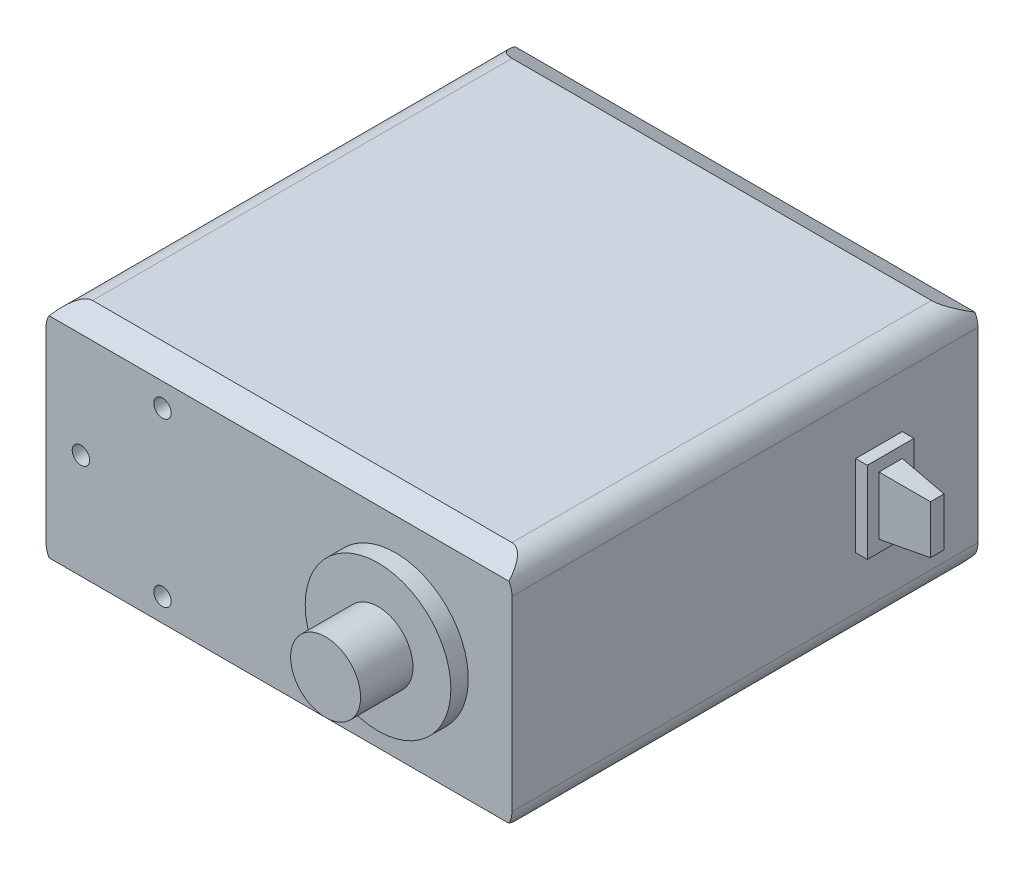
ISO-10303-21;
HEADER;
FILE_DESCRIPTION(('STEP AP214'),'2;1');
FILE_NAME('part.step','',(''),(''),'','','');
FILE_SCHEMA(('AUTOMOTIVE_DESIGN { 1 0 10303 214 1 1 1 1 }'));
ENDSEC;
DATA;
#1=APPLICATION_CONTEXT('core data for automotive mechanical design processes');
#2=APPLICATION_PROTOCOL_DEFINITION('international standard','automotive_design',2000,#1);
#3=PRODUCT_CONTEXT('',#1,'mechanical');
#4=PRODUCT('Part','Part','',(#3));
#5=PRODUCT_RELATED_PRODUCT_CATEGORY('part','',(#4));
#6=PRODUCT_DEFINITION_FORMATION('','',#4);
#7=PRODUCT_DEFINITION_CONTEXT('part definition',#1,'design');
#8=PRODUCT_DEFINITION('design','',#6,#7);
#9=PRODUCT_DEFINITION_SHAPE('','',#8);
#10=(LENGTH_UNIT() NAMED_UNIT(*) SI_UNIT(.MILLI.,.METRE.));
#11=(NAMED_UNIT(*) PLANE_ANGLE_UNIT() SI_UNIT($,.RADIAN.));
#12=(NAMED_UNIT(*) SI_UNIT($,.STERADIAN.) SOLID_ANGLE_UNIT());
#13=UNCERTAINTY_MEASURE_WITH_UNIT(LENGTH_MEASURE(1.E-05),#10,'distance_accuracy_value','');
#14=(GEOMETRIC_REPRESENTATION_CONTEXT(3) GLOBAL_UNCERTAINTY_ASSIGNED_CONTEXT((#13)) GLOBAL_UNIT_ASSIGNED_CONTEXT((#10,
#11,#12)) REPRESENTATION_CONTEXT('',''));
#15=CARTESIAN_POINT('',(0.,0.,0.));
#16=DIRECTION('',(0.,0.,1.));
#17=DIRECTION('',(1.,0.,0.));
#18=AXIS2_PLACEMENT_3D('',#15,#16,#17);
#19=CARTESIAN_POINT('',(40.,20.,0.));
#20=DIRECTION('',(-1.,0.,0.));
#21=DIRECTION('',(0.,0.,1.));
#22=AXIS2_PLACEMENT_3D('',#19,#20,#21);
#23=PLANE('',#22);
#24=DIRECTION('',(0.,-1.,0.));
#25=VECTOR('',#24,1.);
#26=CARTESIAN_POINT('',(40.,20.,40.));
#27=LINE('',#26,#25);
#28=CARTESIAN_POINT('',(40.,18.,40.));
#29=VERTEX_POINT('',#28);
#30=CARTESIAN_POINT('',(40.,2.,40.));
#31=VERTEX_POINT('',#30);
#32=EDGE_CURVE('E320',#29,#31,#27,.T.);
#33=ORIENTED_EDGE('',*,*,#32,.T.);
#34=DIRECTION('',(0.,0.,-1.));
#35=VECTOR('',#34,1.);
#36=CARTESIAN_POINT('',(40.,2.,1.99999999999999));
#37=LINE('',#36,#35);
#38=CARTESIAN_POINT('',(40.,2.,0.));
#39=VERTEX_POINT('',#38);
#40=EDGE_CURVE('E11',#31,#39,#37,.T.);
#41=ORIENTED_EDGE('',*,*,#40,.T.);
#42=DIRECTION('',(0.,-1.,0.));
#43=VECTOR('',#42,1.);
#44=CARTESIAN_POINT('',(40.,20.,0.));
#45=LINE('',#44,#43);
#46=CARTESIAN_POINT('',(40.,18.,0.));
#47=VERTEX_POINT('',#46);
#48=EDGE_CURVE('E317',#47,#39,#45,.T.);
#49=ORIENTED_EDGE('',*,*,#48,.F.);
#50=DIRECTION('',(0.,0.,-1.));
#51=VECTOR('',#50,1.);
#52=CARTESIAN_POINT('',(40.,18.,0.));
#53=LINE('',#52,#51);
#54=EDGE_CURVE('E46',#47,#29,#53,.F.);
#55=ORIENTED_EDGE('',*,*,#54,.T.);
#56=EDGE_LOOP('',(#33,#41,#49,#55));
#57=FACE_BOUND('',#56,.T.);
#58=DIRECTION('',(0.,1.,0.));
#59=VECTOR('',#58,1.);
#60=CARTESIAN_POINT('',(40.,10.,6.49999999999999));
#61=LINE('',#60,#59);
#62=CARTESIAN_POINT('',(40.,6.5,6.49999999999999));
#63=VERTEX_POINT('',#62);
#64=CARTESIAN_POINT('',(40.,13.5,6.49999999999999));
#65=VERTEX_POINT('',#64);
#66=EDGE_CURVE('E188',#63,#65,#61,.T.);
#67=ORIENTED_EDGE('',*,*,#66,.F.);
#68=DIRECTION('',(0.,0.,-1.));
#69=VECTOR('',#68,1.);
#70=CARTESIAN_POINT('',(40.,6.5,10.5));
#71=LINE('',#70,#69);
#72=CARTESIAN_POINT('',(40.,6.5,10.5));
#73=VERTEX_POINT('',#72);
#74=EDGE_CURVE('E226',#73,#63,#71,.T.);
#75=ORIENTED_EDGE('',*,*,#74,.F.);
#76=DIRECTION('',(0.,-1.,0.));
#77=VECTOR('',#76,1.);
#78=CARTESIAN_POINT('',(40.,13.5,10.5));
#79=LINE('',#78,#77);
#80=CARTESIAN_POINT('',(40.,13.5,10.5));
#81=VERTEX_POINT('',#80);
#82=EDGE_CURVE('E238',#81,#73,#79,.T.);
#83=ORIENTED_EDGE('',*,*,#82,.F.);
#84=DIRECTION('',(0.,0.,1.));
#85=VECTOR('',#84,1.);
#86=CARTESIAN_POINT('',(40.,13.5,6.49999999999999));
#87=LINE('',#86,#85);
#88=EDGE_CURVE('E235',#65,#81,#87,.T.);
#89=ORIENTED_EDGE('',*,*,#88,.F.);
#90=EDGE_LOOP('',(#67,#75,#83,#89));
#91=FACE_BOUND('',#90,.T.);
#92=ADVANCED_FACE('F38',(#57,#91),#23,.F.);
#93=CARTESIAN_POINT('',(30.,10.,-1.5));
#94=DIRECTION('',(0.,0.,-1.));
#95=DIRECTION('',(-1.,0.,0.));
#96=AXIS2_PLACEMENT_3D('',#93,#94,#95);
#97=PLANE('',#96);
#98=CARTESIAN_POINT('',(30.,10.,-1.5));
#99=DIRECTION('',(0.,0.,-1.));
#100=DIRECTION('',(-1.,0.,0.));
#101=AXIS2_PLACEMENT_3D('',#98,#99,#100);
#102=CIRCLE('',#101,6.25);
#103=CARTESIAN_POINT('',(23.75,10.,-1.5));
#104=VERTEX_POINT('',#103);
#105=EDGE_CURVE('E300',#104,#104,#102,.T.);
#106=ORIENTED_EDGE('',*,*,#105,.T.);
#107=EDGE_LOOP('',(#106));
#108=FACE_BOUND('',#107,.T.);
#109=CARTESIAN_POINT('',(30.,10.,-1.5));
#110=DIRECTION('',(0.,0.,-1.));
#111=DIRECTION('',(-1.,0.,0.));
#112=AXIS2_PLACEMENT_3D('',#109,#110,#111);
#113=CIRCLE('',#112,3.);
#114=CARTESIAN_POINT('',(27.,10.,-1.5));
#115=VERTEX_POINT('',#114);
#116=EDGE_CURVE('E294',#115,#115,#113,.T.);
#117=ORIENTED_EDGE('',*,*,#116,.F.);
#118=EDGE_LOOP('',(#117));
#119=FACE_BOUND('',#118,.T.);
#120=ADVANCED_FACE('F457',(#108,#119),#97,.T.);
#121=CARTESIAN_POINT('',(0.,20.,0.));
#122=DIRECTION('',(0.,0.,1.));
#123=DIRECTION('',(1.,0.,0.));
#124=AXIS2_PLACEMENT_3D('',#121,#122,#123);
#125=PLANE('',#124);
#126=CARTESIAN_POINT('',(17.5,2.5,0.));
#127=DIRECTION('',(0.,0.,-1.));
#128=DIRECTION('',(-1.,0.,0.));
#129=AXIS2_PLACEMENT_3D('',#126,#127,#128);
#130=CIRCLE('',#129,0.750000000000002);
#131=CARTESIAN_POINT('',(16.75,2.5,0.));
#132=VERTEX_POINT('',#131);
#133=EDGE_CURVE('E270',#132,#132,#130,.T.);
#134=ORIENTED_EDGE('',*,*,#133,.F.);
#135=EDGE_LOOP('',(#134));
#136=FACE_BOUND('',#135,.T.);
#137=CARTESIAN_POINT('',(2.5,2.5,0.));
#138=DIRECTION('',(0.,0.,-1.));
#139=DIRECTION('',(-1.,0.,0.));
#140=AXIS2_PLACEMENT_3D('',#137,#138,#139);
#141=CIRCLE('',#140,0.75);
#142=CARTESIAN_POINT('',(1.75,2.5,0.));
#143=VERTEX_POINT('',#142);
#144=EDGE_CURVE('E276',#143,#143,#141,.T.);
#145=ORIENTED_EDGE('',*,*,#144,.F.);
#146=EDGE_LOOP('',(#145));
#147=FACE_BOUND('',#146,.T.);
#148=CARTESIAN_POINT('',(2.5,17.5,0.));
#149=DIRECTION('',(0.,0.,-1.));
#150=DIRECTION('',(-1.,0.,0.));
#151=AXIS2_PLACEMENT_3D('',#148,#149,#150);
#152=CIRCLE('',#151,0.75);
#153=CARTESIAN_POINT('',(1.75,17.5,0.));
#154=VERTEX_POINT('',#153);
#155=EDGE_CURVE('E282',#154,#154,#152,.T.);
#156=ORIENTED_EDGE('',*,*,#155,.F.);
#157=EDGE_LOOP('',(#156));
#158=FACE_BOUND('',#157,.T.);
#159=CARTESIAN_POINT('',(17.5,17.5,0.));
#160=DIRECTION('',(0.,0.,-1.));
#161=DIRECTION('',(-1.,0.,0.));
#162=AXIS2_PLACEMENT_3D('',#159,#160,#161);
#163=CIRCLE('',#162,0.750000000000002);
#164=CARTESIAN_POINT('',(16.75,17.5,0.));
#165=VERTEX_POINT('',#164);
#166=EDGE_CURVE('E288',#165,#165,#163,.T.);
#167=ORIENTED_EDGE('',*,*,#166,.F.);
#168=EDGE_LOOP('',(#167));
#169=FACE_BOUND('',#168,.T.);
#170=DIRECTION('',(1.,0.,0.));
#171=VECTOR('',#170,1.);
#172=CARTESIAN_POINT('',(0.,1.,0.));
#173=LINE('',#172,#171);
#174=CARTESIAN_POINT('',(0.267949192431122,1.,0.));
#175=VERTEX_POINT('',#174);
#176=CARTESIAN_POINT('',(39.7320508075689,1.,0.));
#177=VERTEX_POINT('',#176);
#178=EDGE_CURVE('E407',#175,#177,#173,.T.);
#179=ORIENTED_EDGE('',*,*,#178,.F.);
#180=CARTESIAN_POINT('',(2.,2.,0.));
#181=DIRECTION('',(0.,0.,1.));
#182=DIRECTION('',(1.,0.,0.));
#183=AXIS2_PLACEMENT_3D('',#180,#181,#182);
#184=CIRCLE('',#183,2.);
#185=CARTESIAN_POINT('',(0.,2.,0.));
#186=VERTEX_POINT('',#185);
#187=EDGE_CURVE('E363',#175,#186,#184,.F.);
#188=ORIENTED_EDGE('',*,*,#187,.T.);
#189=DIRECTION('',(0.,-1.,0.));
#190=VECTOR('',#189,1.);
#191=CARTESIAN_POINT('',(0.,20.,0.));
#192=LINE('',#191,#190);
#193=CARTESIAN_POINT('',(0.,18.,0.));
#194=VERTEX_POINT('',#193);
#195=EDGE_CURVE('E314',#194,#186,#192,.T.);
#196=ORIENTED_EDGE('',*,*,#195,.F.);
#197=CARTESIAN_POINT('',(2.,18.,0.));
#198=DIRECTION('',(0.,0.,1.));
#199=DIRECTION('',(1.,0.,0.));
#200=AXIS2_PLACEMENT_3D('',#197,#198,#199);
#201=CIRCLE('',#200,2.);
#202=CARTESIAN_POINT('',(0.267949192431121,19.,0.));
#203=VERTEX_POINT('',#202);
#204=EDGE_CURVE('E361',#194,#203,#201,.F.);
#205=ORIENTED_EDGE('',*,*,#204,.T.);
#206=DIRECTION('',(1.,0.,0.));
#207=VECTOR('',#206,1.);
#208=CARTESIAN_POINT('',(0.,19.,0.));
#209=LINE('',#208,#207);
#210=CARTESIAN_POINT('',(39.7320508075689,19.,0.));
#211=VERTEX_POINT('',#210);
#212=EDGE_CURVE('E401',#203,#211,#209,.T.);
#213=ORIENTED_EDGE('',*,*,#212,.T.);
#214=CARTESIAN_POINT('',(38.,18.,0.));
#215=DIRECTION('',(0.,0.,1.));
#216=DIRECTION('',(1.,0.,0.));
#217=AXIS2_PLACEMENT_3D('',#214,#215,#216);
#218=CIRCLE('',#217,2.);
#219=EDGE_CURVE('E357',#211,#47,#218,.F.);
#220=ORIENTED_EDGE('',*,*,#219,.T.);
#221=ORIENTED_EDGE('',*,*,#48,.T.);
#222=CARTESIAN_POINT('',(38.,2.,0.));
#223=DIRECTION('',(0.,0.,1.));
#224=DIRECTION('',(1.,0.,0.));
#225=AXIS2_PLACEMENT_3D('',#222,#223,#224);
#226=CIRCLE('',#225,2.);
#227=EDGE_CURVE('E359',#39,#177,#226,.F.);
#228=ORIENTED_EDGE('',*,*,#227,.T.);
#229=EDGE_LOOP('',(#179,#188,#196,#205,#213,#220,#221,#228));
#230=FACE_BOUND('',#229,.T.);
#231=CARTESIAN_POINT('',(30.,10.,0.));
#232=DIRECTION('',(0.,0.,1.));
#233=DIRECTION('',(1.,0.,0.));
#234=AXIS2_PLACEMENT_3D('',#231,#232,#233);
#235=CIRCLE('',#234,6.25);
#236=CARTESIAN_POINT('',(36.25,10.,0.));
#237=VERTEX_POINT('',#236);
#238=EDGE_CURVE('E329',#237,#237,#235,.F.);
#239=ORIENTED_EDGE('',*,*,#238,.F.);
#240=EDGE_LOOP('',(#239));
#241=FACE_BOUND('',#240,.T.);
#242=ADVANCED_FACE('F422',(#136,#147,#158,#169,#230,#241),#125,.F.);
#243=CARTESIAN_POINT('',(30.,10.,41.5));
#244=DIRECTION('',(0.,0.,1.));
#245=DIRECTION('',(1.,0.,0.));
#246=AXIS2_PLACEMENT_3D('',#243,#244,#245);
#247=PLANE('',#246);
#248=CARTESIAN_POINT('',(30.,10.,41.5));
#249=DIRECTION('',(0.,0.,1.));
#250=DIRECTION('',(1.,0.,0.));
#251=AXIS2_PLACEMENT_3D('',#248,#249,#250);
#252=CIRCLE('',#251,6.25);
#253=CARTESIAN_POINT('',(36.25,10.,41.5));
#254=VERTEX_POINT('',#253);
#255=EDGE_CURVE('E309',#254,#254,#252,.T.);
#256=ORIENTED_EDGE('',*,*,#255,.T.);
#257=EDGE_LOOP('',(#256));
#258=FACE_BOUND('',#257,.T.);
#259=CARTESIAN_POINT('',(30.,10.,41.5));
#260=DIRECTION('',(0.,0.,1.));
#261=DIRECTION('',(1.,0.,0.));
#262=AXIS2_PLACEMENT_3D('',#259,#260,#261);
#263=CIRCLE('',#262,3.);
#264=CARTESIAN_POINT('',(33.,10.,41.5));
#265=VERTEX_POINT('',#264);
#266=EDGE_CURVE('E305',#265,#265,#263,.T.);
#267=ORIENTED_EDGE('',*,*,#266,.F.);
#268=EDGE_LOOP('',(#267));
#269=FACE_BOUND('',#268,.T.);
#270=ADVANCED_FACE('F469',(#258,#269),#247,.T.);
#271=CARTESIAN_POINT('',(40.,20.,40.));
#272=DIRECTION('',(0.,0.,-1.));
#273=DIRECTION('',(-1.,0.,0.));
#274=AXIS2_PLACEMENT_3D('',#271,#272,#273);
#275=PLANE('',#274);
#276=CARTESIAN_POINT('',(10.,3.00000000000011,40.));
#277=DIRECTION('',(0.,0.,1.));
#278=DIRECTION('',(1.,0.,0.));
#279=AXIS2_PLACEMENT_3D('',#276,#277,#278);
#280=CIRCLE('',#279,0.749999999999998);
#281=CARTESIAN_POINT('',(10.75,3.00000000000011,40.));
#282=VERTEX_POINT('',#281);
#283=EDGE_CURVE('E254',#282,#282,#280,.T.);
#284=ORIENTED_EDGE('',*,*,#283,.F.);
#285=EDGE_LOOP('',(#284));
#286=FACE_BOUND('',#285,.T.);
#287=CARTESIAN_POINT('',(3.,10.,40.));
#288=DIRECTION('',(0.,0.,1.));
#289=DIRECTION('',(1.,0.,0.));
#290=AXIS2_PLACEMENT_3D('',#287,#288,#289);
#291=CIRCLE('',#290,0.749999999999998);
#292=CARTESIAN_POINT('',(3.75,10.,40.));
#293=VERTEX_POINT('',#292);
#294=EDGE_CURVE('E258',#293,#293,#291,.T.);
#295=ORIENTED_EDGE('',*,*,#294,.F.);
#296=EDGE_LOOP('',(#295));
#297=FACE_BOUND('',#296,.T.);
#298=CARTESIAN_POINT('',(10.,17.,40.));
#299=DIRECTION('',(0.,0.,1.));
#300=DIRECTION('',(1.,0.,0.));
#301=AXIS2_PLACEMENT_3D('',#298,#299,#300);
#302=CIRCLE('',#301,0.75);
#303=CARTESIAN_POINT('',(10.75,17.,40.));
#304=VERTEX_POINT('',#303);
#305=EDGE_CURVE('E264',#304,#304,#302,.T.);
#306=ORIENTED_EDGE('',*,*,#305,.F.);
#307=EDGE_LOOP('',(#306));
#308=FACE_BOUND('',#307,.T.);
#309=DIRECTION('',(0.,-1.,0.));
#310=VECTOR('',#309,1.);
#311=CARTESIAN_POINT('',(0.,20.,40.));
#312=LINE('',#311,#310);
#313=CARTESIAN_POINT('',(0.,18.,40.));
#314=VERTEX_POINT('',#313);
#315=CARTESIAN_POINT('',(0.,2.,40.));
#316=VERTEX_POINT('',#315);
#317=EDGE_CURVE('E323',#314,#316,#312,.T.);
#318=ORIENTED_EDGE('',*,*,#317,.T.);
#319=CARTESIAN_POINT('',(2.,2.,40.));
#320=DIRECTION('',(0.,0.,-1.));
#321=DIRECTION('',(-1.,0.,0.));
#322=AXIS2_PLACEMENT_3D('',#319,#320,#321);
#323=CIRCLE('',#322,2.);
#324=CARTESIAN_POINT('',(0.267949192431121,1.,40.));
#325=VERTEX_POINT('',#324);
#326=EDGE_CURVE('E343',#316,#325,#323,.F.);
#327=ORIENTED_EDGE('',*,*,#326,.T.);
#328=DIRECTION('',(1.,0.,0.));
#329=VECTOR('',#328,1.);
#330=CARTESIAN_POINT('',(0.,1.,40.));
#331=LINE('',#330,#329);
#332=CARTESIAN_POINT('',(39.7320508075689,1.,40.));
#333=VERTEX_POINT('',#332);
#334=EDGE_CURVE('E432',#325,#333,#331,.T.);
#335=ORIENTED_EDGE('',*,*,#334,.T.);
#336=CARTESIAN_POINT('',(38.,2.,40.));
#337=DIRECTION('',(0.,0.,-1.));
#338=DIRECTION('',(-1.,0.,0.));
#339=AXIS2_PLACEMENT_3D('',#336,#337,#338);
#340=CIRCLE('',#339,2.);
#341=EDGE_CURVE('E339',#333,#31,#340,.F.);
#342=ORIENTED_EDGE('',*,*,#341,.T.);
#343=ORIENTED_EDGE('',*,*,#32,.F.);
#344=CARTESIAN_POINT('',(38.,18.,40.));
#345=DIRECTION('',(0.,0.,-1.));
#346=DIRECTION('',(-1.,0.,0.));
#347=AXIS2_PLACEMENT_3D('',#344,#345,#346);
#348=CIRCLE('',#347,2.);
#349=CARTESIAN_POINT('',(39.7320508075689,19.,40.));
#350=VERTEX_POINT('',#349);
#351=EDGE_CURVE('E337',#29,#350,#348,.F.);
#352=ORIENTED_EDGE('',*,*,#351,.T.);
#353=DIRECTION('',(1.,0.,0.));
#354=VECTOR('',#353,1.);
#355=CARTESIAN_POINT('',(0.,19.,40.));
#356=LINE('',#355,#354);
#357=CARTESIAN_POINT('',(0.267949192431121,19.,40.));
#358=VERTEX_POINT('',#357);
#359=EDGE_CURVE('E404',#358,#350,#356,.T.);
#360=ORIENTED_EDGE('',*,*,#359,.F.);
#361=CARTESIAN_POINT('',(2.,18.,40.));
#362=DIRECTION('',(0.,0.,-1.));
#363=DIRECTION('',(-1.,0.,0.));
#364=AXIS2_PLACEMENT_3D('',#361,#362,#363);
#365=CIRCLE('',#364,2.);
#366=EDGE_CURVE('E341',#358,#314,#365,.F.);
#367=ORIENTED_EDGE('',*,*,#366,.T.);
#368=EDGE_LOOP('',(#318,#327,#335,#342,#343,#352,#360,#367));
#369=FACE_BOUND('',#368,.T.);
#370=CARTESIAN_POINT('',(30.,10.,40.));
#371=DIRECTION('',(0.,0.,-1.));
#372=DIRECTION('',(-1.,0.,0.));
#373=AXIS2_PLACEMENT_3D('',#370,#371,#372);
#374=CIRCLE('',#373,6.25);
#375=CARTESIAN_POINT('',(23.75,10.,40.));
#376=VERTEX_POINT('',#375);
#377=EDGE_CURVE('E326',#376,#376,#374,.F.);
#378=ORIENTED_EDGE('',*,*,#377,.F.);
#379=EDGE_LOOP('',(#378));
#380=FACE_BOUND('',#379,.T.);
#381=ADVANCED_FACE('F385',(#286,#297,#308,#369,#380),#275,.F.);
#382=CARTESIAN_POINT('',(0.,20.,40.));
#383=DIRECTION('',(1.,0.,0.));
#384=DIRECTION('',(0.,0.,-1.));
#385=AXIS2_PLACEMENT_3D('',#382,#383,#384);
#386=PLANE('',#385);
#387=ORIENTED_EDGE('',*,*,#195,.T.);
#388=DIRECTION('',(0.,0.,1.));
#389=VECTOR('',#388,1.);
#390=CARTESIAN_POINT('',(0.,2.,38.));
#391=LINE('',#390,#389);
#392=EDGE_CURVE('E334',#186,#316,#391,.T.);
#393=ORIENTED_EDGE('',*,*,#392,.T.);
#394=ORIENTED_EDGE('',*,*,#317,.F.);
#395=DIRECTION('',(0.,0.,1.));
#396=VECTOR('',#395,1.);
#397=CARTESIAN_POINT('',(0.,18.,40.));
#398=LINE('',#397,#396);
#399=EDGE_CURVE('E332',#314,#194,#398,.F.);
#400=ORIENTED_EDGE('',*,*,#399,.T.);
#401=EDGE_LOOP('',(#387,#393,#394,#400));
#402=FACE_BOUND('',#401,.T.);
#403=ADVANCED_FACE('F418',(#402),#386,.F.);
#404=CARTESIAN_POINT('',(0.,20.,0.));
#405=DIRECTION('',(0.,-1.,0.));
#406=DIRECTION('',(0.,0.,-1.));
#407=AXIS2_PLACEMENT_3D('',#404,#405,#406);
#408=PLANE('',#407);
#409=DIRECTION('',(1.,0.,0.));
#410=VECTOR('',#409,1.);
#411=CARTESIAN_POINT('',(0.,20.,2.00000000000001));
#412=LINE('',#411,#410);
#413=CARTESIAN_POINT('',(2.,20.,2.00000000000001));
#414=VERTEX_POINT('',#413);
#415=CARTESIAN_POINT('',(38.,20.,2.));
#416=VERTEX_POINT('',#415);
#417=EDGE_CURVE('E395',#414,#416,#412,.T.);
#418=ORIENTED_EDGE('',*,*,#417,.F.);
#419=DIRECTION('',(0.,0.,1.));
#420=VECTOR('',#419,1.);
#421=CARTESIAN_POINT('',(2.,20.,0.));
#422=LINE('',#421,#420);
#423=CARTESIAN_POINT('',(2.,20.,38.));
#424=VERTEX_POINT('',#423);
#425=EDGE_CURVE('E368',#414,#424,#422,.T.);
#426=ORIENTED_EDGE('',*,*,#425,.T.);
#427=DIRECTION('',(1.,0.,0.));
#428=VECTOR('',#427,1.);
#429=CARTESIAN_POINT('',(0.,20.,38.));
#430=LINE('',#429,#428);
#431=CARTESIAN_POINT('',(38.,20.,38.));
#432=VERTEX_POINT('',#431);
#433=EDGE_CURVE('E199',#424,#432,#430,.T.);
#434=ORIENTED_EDGE('',*,*,#433,.T.);
#435=DIRECTION('',(0.,0.,-1.));
#436=VECTOR('',#435,1.);
#437=CARTESIAN_POINT('',(38.,20.,0.));
#438=LINE('',#437,#436);
#439=EDGE_CURVE('E365',#432,#416,#438,.T.);
#440=ORIENTED_EDGE('',*,*,#439,.T.);
#441=EDGE_LOOP('',(#418,#426,#434,#440));
#442=FACE_BOUND('',#441,.T.);
#443=ADVANCED_FACE('F394',(#442),#408,.F.);
#444=CARTESIAN_POINT('',(0.,0.,0.));
#445=DIRECTION('',(0.,-1.,0.));
#446=DIRECTION('',(0.,0.,-1.));
#447=AXIS2_PLACEMENT_3D('',#444,#445,#446);
#448=PLANE('',#447);
#449=DIRECTION('',(1.,0.,0.));
#450=VECTOR('',#449,1.);
#451=CARTESIAN_POINT('',(0.,0.,38.));
#452=LINE('',#451,#450);
#453=CARTESIAN_POINT('',(2.,0.,38.));
#454=VERTEX_POINT('',#453);
#455=CARTESIAN_POINT('',(38.,0.,38.));
#456=VERTEX_POINT('',#455);
#457=EDGE_CURVE('E438',#454,#456,#452,.T.);
#458=ORIENTED_EDGE('',*,*,#457,.F.);
#459=DIRECTION('',(0.,0.,1.));
#460=VECTOR('',#459,1.);
#461=CARTESIAN_POINT('',(2.,0.,2.));
#462=LINE('',#461,#460);
#463=CARTESIAN_POINT('',(2.,0.,2.));
#464=VERTEX_POINT('',#463);
#465=EDGE_CURVE('E351',#454,#464,#462,.F.);
#466=ORIENTED_EDGE('',*,*,#465,.T.);
#467=DIRECTION('',(1.,0.,0.));
#468=VECTOR('',#467,1.);
#469=CARTESIAN_POINT('',(0.,0.,2.));
#470=LINE('',#469,#468);
#471=CARTESIAN_POINT('',(38.,0.,1.99999999999999));
#472=VERTEX_POINT('',#471);
#473=EDGE_CURVE('E402',#464,#472,#470,.T.);
#474=ORIENTED_EDGE('',*,*,#473,.T.);
#475=DIRECTION('',(0.,0.,-1.));
#476=VECTOR('',#475,1.);
#477=CARTESIAN_POINT('',(38.,0.,38.));
#478=LINE('',#477,#476);
#479=EDGE_CURVE('E349',#472,#456,#478,.F.);
#480=ORIENTED_EDGE('',*,*,#479,.T.);
#481=EDGE_LOOP('',(#458,#466,#474,#480));
#482=FACE_BOUND('',#481,.T.);
#483=ADVANCED_FACE('F442',(#482),#448,.T.);
#484=CARTESIAN_POINT('',(30.,10.,41.5));
#485=DIRECTION('',(0.,0.,-1.));
#486=DIRECTION('',(-1.,0.,0.));
#487=AXIS2_PLACEMENT_3D('',#484,#485,#486);
#488=CYLINDRICAL_SURFACE('',#487,6.25);
#489=ORIENTED_EDGE('',*,*,#255,.F.);
#490=EDGE_LOOP('',(#489));
#491=FACE_BOUND('',#490,.T.);
#492=ORIENTED_EDGE('',*,*,#377,.T.);
#493=EDGE_LOOP('',(#492));
#494=FACE_BOUND('',#493,.T.);
#495=ADVANCED_FACE('F596',(#491,#494),#488,.T.);
#496=CARTESIAN_POINT('',(30.,10.,46.));
#497=DIRECTION('',(0.,0.,-1.));
#498=DIRECTION('',(-1.,0.,0.));
#499=AXIS2_PLACEMENT_3D('',#496,#497,#498);
#500=CYLINDRICAL_SURFACE('',#499,3.);
#501=CARTESIAN_POINT('',(30.,10.,46.));
#502=DIRECTION('',(0.,0.,1.));
#503=DIRECTION('',(1.,0.,0.));
#504=AXIS2_PLACEMENT_3D('',#501,#502,#503);
#505=CIRCLE('',#504,3.);
#506=CARTESIAN_POINT('',(33.,10.,46.));
#507=VERTEX_POINT('',#506);
#508=EDGE_CURVE('E306',#507,#507,#505,.T.);
#509=ORIENTED_EDGE('',*,*,#508,.F.);
#510=EDGE_LOOP('',(#509));
#511=FACE_BOUND('',#510,.T.);
#512=ORIENTED_EDGE('',*,*,#266,.T.);
#513=EDGE_LOOP('',(#512));
#514=FACE_BOUND('',#513,.T.);
#515=ADVANCED_FACE('F592',(#511,#514),#500,.T.);
#516=CARTESIAN_POINT('',(30.,10.,46.));
#517=DIRECTION('',(0.,0.,1.));
#518=DIRECTION('',(1.,0.,0.));
#519=AXIS2_PLACEMENT_3D('',#516,#517,#518);
#520=PLANE('',#519);
#521=ORIENTED_EDGE('',*,*,#508,.T.);
#522=EDGE_LOOP('',(#521));
#523=FACE_BOUND('',#522,.T.);
#524=ADVANCED_FACE('F588',(#523),#520,.T.);
#525=CARTESIAN_POINT('',(30.,10.,-1.5));
#526=DIRECTION('',(0.,0.,1.));
#527=DIRECTION('',(1.,0.,0.));
#528=AXIS2_PLACEMENT_3D('',#525,#526,#527);
#529=CYLINDRICAL_SURFACE('',#528,6.25);
#530=ORIENTED_EDGE('',*,*,#105,.F.);
#531=EDGE_LOOP('',(#530));
#532=FACE_BOUND('',#531,.T.);
#533=ORIENTED_EDGE('',*,*,#238,.T.);
#534=EDGE_LOOP('',(#533));
#535=FACE_BOUND('',#534,.T.);
#536=ADVANCED_FACE('F583',(#532,#535),#529,.T.);
#537=CARTESIAN_POINT('',(30.,10.,-5.2));
#538=DIRECTION('',(0.,0.,1.));
#539=DIRECTION('',(1.,0.,0.));
#540=AXIS2_PLACEMENT_3D('',#537,#538,#539);
#541=CYLINDRICAL_SURFACE('',#540,3.);
#542=CARTESIAN_POINT('',(30.,10.,-5.2));
#543=DIRECTION('',(0.,0.,-1.));
#544=DIRECTION('',(-1.,0.,0.));
#545=AXIS2_PLACEMENT_3D('',#542,#543,#544);
#546=CIRCLE('',#545,3.);
#547=CARTESIAN_POINT('',(27.,10.,-5.2));
#548=VERTEX_POINT('',#547);
#549=EDGE_CURVE('E297',#548,#548,#546,.T.);
#550=ORIENTED_EDGE('',*,*,#549,.F.);
#551=EDGE_LOOP('',(#550));
#552=FACE_BOUND('',#551,.T.);
#553=ORIENTED_EDGE('',*,*,#116,.T.);
#554=EDGE_LOOP('',(#553));
#555=FACE_BOUND('',#554,.T.);
#556=ADVANCED_FACE('F580',(#552,#555),#541,.T.);
#557=CARTESIAN_POINT('',(30.,10.,-5.2));
#558=DIRECTION('',(0.,0.,-1.));
#559=DIRECTION('',(-1.,0.,0.));
#560=AXIS2_PLACEMENT_3D('',#557,#558,#559);
#561=PLANE('',#560);
#562=ORIENTED_EDGE('',*,*,#549,.T.);
#563=EDGE_LOOP('',(#562));
#564=FACE_BOUND('',#563,.T.);
#565=ADVANCED_FACE('F576',(#564),#561,.T.);
#566=CARTESIAN_POINT('',(17.5,17.5,5.));
#567=DIRECTION('',(0.,0.,-1.));
#568=DIRECTION('',(-1.,0.,0.));
#569=AXIS2_PLACEMENT_3D('',#566,#567,#568);
#570=CYLINDRICAL_SURFACE('',#569,0.750000000000002);
#571=CARTESIAN_POINT('',(17.5,17.5,5.));
#572=DIRECTION('',(0.,0.,-1.));
#573=DIRECTION('',(-1.,0.,0.));
#574=AXIS2_PLACEMENT_3D('',#571,#572,#573);
#575=CIRCLE('',#574,0.750000000000002);
#576=CARTESIAN_POINT('',(16.75,17.5,5.));
#577=VERTEX_POINT('',#576);
#578=EDGE_CURVE('E291',#577,#577,#575,.T.);
#579=ORIENTED_EDGE('',*,*,#578,.F.);
#580=EDGE_LOOP('',(#579));
#581=FACE_BOUND('',#580,.T.);
#582=ORIENTED_EDGE('',*,*,#166,.T.);
#583=EDGE_LOOP('',(#582));
#584=FACE_BOUND('',#583,.T.);
#585=ADVANCED_FACE('F572',(#581,#584),#570,.F.);
#586=CARTESIAN_POINT('',(17.5,17.5,5.));
#587=DIRECTION('',(0.,0.,-1.));
#588=DIRECTION('',(-1.,0.,0.));
#589=AXIS2_PLACEMENT_3D('',#586,#587,#588);
#590=PLANE('',#589);
#591=ORIENTED_EDGE('',*,*,#578,.T.);
#592=EDGE_LOOP('',(#591));
#593=FACE_BOUND('',#592,.T.);
#594=ADVANCED_FACE('F568',(#593),#590,.T.);
#595=CARTESIAN_POINT('',(2.5,17.5,5.));
#596=DIRECTION('',(0.,0.,-1.));
#597=DIRECTION('',(-1.,0.,0.));
#598=AXIS2_PLACEMENT_3D('',#595,#596,#597);
#599=CYLINDRICAL_SURFACE('',#598,0.75);
#600=CARTESIAN_POINT('',(2.5,17.5,5.));
#601=DIRECTION('',(0.,0.,-1.));
#602=DIRECTION('',(-1.,0.,0.));
#603=AXIS2_PLACEMENT_3D('',#600,#601,#602);
#604=CIRCLE('',#603,0.75);
#605=CARTESIAN_POINT('',(1.75,17.5,5.));
#606=VERTEX_POINT('',#605);
#607=EDGE_CURVE('E285',#606,#606,#604,.T.);
#608=ORIENTED_EDGE('',*,*,#607,.F.);
#609=EDGE_LOOP('',(#608));
#610=FACE_BOUND('',#609,.T.);
#611=ORIENTED_EDGE('',*,*,#155,.T.);
#612=EDGE_LOOP('',(#611));
#613=FACE_BOUND('',#612,.T.);
#614=ADVANCED_FACE('F564',(#610,#613),#599,.F.);
#615=CARTESIAN_POINT('',(2.5,17.5,5.));
#616=DIRECTION('',(0.,0.,-1.));
#617=DIRECTION('',(-1.,0.,0.));
#618=AXIS2_PLACEMENT_3D('',#615,#616,#617);
#619=PLANE('',#618);
#620=ORIENTED_EDGE('',*,*,#607,.T.);
#621=EDGE_LOOP('',(#620));
#622=FACE_BOUND('',#621,.T.);
#623=ADVANCED_FACE('F560',(#622),#619,.T.);
#624=CARTESIAN_POINT('',(2.5,2.5,5.));
#625=DIRECTION('',(0.,0.,-1.));
#626=DIRECTION('',(-1.,0.,0.));
#627=AXIS2_PLACEMENT_3D('',#624,#625,#626);
#628=CYLINDRICAL_SURFACE('',#627,0.75);
#629=CARTESIAN_POINT('',(2.5,2.5,5.));
#630=DIRECTION('',(0.,0.,-1.));
#631=DIRECTION('',(-1.,0.,0.));
#632=AXIS2_PLACEMENT_3D('',#629,#630,#631);
#633=CIRCLE('',#632,0.75);
#634=CARTESIAN_POINT('',(1.75,2.5,5.));
#635=VERTEX_POINT('',#634);
#636=EDGE_CURVE('E279',#635,#635,#633,.T.);
#637=ORIENTED_EDGE('',*,*,#636,.F.);
#638=EDGE_LOOP('',(#637));
#639=FACE_BOUND('',#638,.T.);
#640=ORIENTED_EDGE('',*,*,#144,.T.);
#641=EDGE_LOOP('',(#640));
#642=FACE_BOUND('',#641,.T.);
#643=ADVANCED_FACE('F556',(#639,#642),#628,.F.);
#644=CARTESIAN_POINT('',(2.5,2.5,5.));
#645=DIRECTION('',(0.,0.,-1.));
#646=DIRECTION('',(-1.,0.,0.));
#647=AXIS2_PLACEMENT_3D('',#644,#645,#646);
#648=PLANE('',#647);
#649=ORIENTED_EDGE('',*,*,#636,.T.);
#650=EDGE_LOOP('',(#649));
#651=FACE_BOUND('',#650,.T.);
#652=ADVANCED_FACE('F552',(#651),#648,.T.);
#653=CARTESIAN_POINT('',(17.5,2.5,5.));
#654=DIRECTION('',(0.,0.,-1.));
#655=DIRECTION('',(-1.,0.,0.));
#656=AXIS2_PLACEMENT_3D('',#653,#654,#655);
#657=CYLINDRICAL_SURFACE('',#656,0.750000000000002);
#658=CARTESIAN_POINT('',(17.5,2.5,5.));
#659=DIRECTION('',(0.,0.,-1.));
#660=DIRECTION('',(-1.,0.,0.));
#661=AXIS2_PLACEMENT_3D('',#658,#659,#660);
#662=CIRCLE('',#661,0.750000000000002);
#663=CARTESIAN_POINT('',(16.75,2.5,5.));
#664=VERTEX_POINT('',#663);
#665=EDGE_CURVE('E273',#664,#664,#662,.T.);
#666=ORIENTED_EDGE('',*,*,#665,.F.);
#667=EDGE_LOOP('',(#666));
#668=FACE_BOUND('',#667,.T.);
#669=ORIENTED_EDGE('',*,*,#133,.T.);
#670=EDGE_LOOP('',(#669));
#671=FACE_BOUND('',#670,.T.);
#672=ADVANCED_FACE('F548',(#668,#671),#657,.F.);
#673=CARTESIAN_POINT('',(17.5,2.5,5.));
#674=DIRECTION('',(0.,0.,-1.));
#675=DIRECTION('',(-1.,0.,0.));
#676=AXIS2_PLACEMENT_3D('',#673,#674,#675);
#677=PLANE('',#676);
#678=ORIENTED_EDGE('',*,*,#665,.T.);
#679=EDGE_LOOP('',(#678));
#680=FACE_BOUND('',#679,.T.);
#681=ADVANCED_FACE('F544',(#680),#677,.T.);
#682=CARTESIAN_POINT('',(10.,17.,35.));
#683=DIRECTION('',(0.,0.,1.));
#684=DIRECTION('',(1.,0.,0.));
#685=AXIS2_PLACEMENT_3D('',#682,#683,#684);
#686=CYLINDRICAL_SURFACE('',#685,0.75);
#687=CARTESIAN_POINT('',(10.,17.,35.));
#688=DIRECTION('',(0.,0.,1.));
#689=DIRECTION('',(1.,0.,0.));
#690=AXIS2_PLACEMENT_3D('',#687,#688,#689);
#691=CIRCLE('',#690,0.75);
#692=CARTESIAN_POINT('',(10.75,17.,35.));
#693=VERTEX_POINT('',#692);
#694=EDGE_CURVE('E267',#693,#693,#691,.T.);
#695=ORIENTED_EDGE('',*,*,#694,.F.);
#696=EDGE_LOOP('',(#695));
#697=FACE_BOUND('',#696,.T.);
#698=ORIENTED_EDGE('',*,*,#305,.T.);
#699=EDGE_LOOP('',(#698));
#700=FACE_BOUND('',#699,.T.);
#701=ADVANCED_FACE('F540',(#697,#700),#686,.F.);
#702=CARTESIAN_POINT('',(10.,17.,35.));
#703=DIRECTION('',(0.,0.,1.));
#704=DIRECTION('',(1.,0.,0.));
#705=AXIS2_PLACEMENT_3D('',#702,#703,#704);
#706=PLANE('',#705);
#707=ORIENTED_EDGE('',*,*,#694,.T.);
#708=EDGE_LOOP('',(#707));
#709=FACE_BOUND('',#708,.T.);
#710=ADVANCED_FACE('F536',(#709),#706,.T.);
#711=CARTESIAN_POINT('',(3.,10.,35.));
#712=DIRECTION('',(0.,0.,1.));
#713=DIRECTION('',(1.,0.,0.));
#714=AXIS2_PLACEMENT_3D('',#711,#712,#713);
#715=CYLINDRICAL_SURFACE('',#714,0.749999999999998);
#716=CARTESIAN_POINT('',(3.,10.,35.));
#717=DIRECTION('',(0.,0.,1.));
#718=DIRECTION('',(1.,0.,0.));
#719=AXIS2_PLACEMENT_3D('',#716,#717,#718);
#720=CIRCLE('',#719,0.749999999999998);
#721=CARTESIAN_POINT('',(3.75,10.,35.));
#722=VERTEX_POINT('',#721);
#723=EDGE_CURVE('E261',#722,#722,#720,.T.);
#724=ORIENTED_EDGE('',*,*,#723,.F.);
#725=EDGE_LOOP('',(#724));
#726=FACE_BOUND('',#725,.T.);
#727=ORIENTED_EDGE('',*,*,#294,.T.);
#728=EDGE_LOOP('',(#727));
#729=FACE_BOUND('',#728,.T.);
#730=ADVANCED_FACE('F532',(#726,#729),#715,.F.);
#731=CARTESIAN_POINT('',(3.,10.,35.));
#732=DIRECTION('',(0.,0.,1.));
#733=DIRECTION('',(1.,0.,0.));
#734=AXIS2_PLACEMENT_3D('',#731,#732,#733);
#735=PLANE('',#734);
#736=ORIENTED_EDGE('',*,*,#723,.T.);
#737=EDGE_LOOP('',(#736));
#738=FACE_BOUND('',#737,.T.);
#739=ADVANCED_FACE('F528',(#738),#735,.T.);
#740=CARTESIAN_POINT('',(10.,3.00000000000011,35.));
#741=DIRECTION('',(0.,0.,1.));
#742=DIRECTION('',(1.,0.,0.));
#743=AXIS2_PLACEMENT_3D('',#740,#741,#742);
#744=CYLINDRICAL_SURFACE('',#743,0.749999999999998);
#745=CARTESIAN_POINT('',(10.,3.00000000000011,35.));
#746=DIRECTION('',(0.,0.,1.));
#747=DIRECTION('',(1.,0.,0.));
#748=AXIS2_PLACEMENT_3D('',#745,#746,#747);
#749=CIRCLE('',#748,0.749999999999998);
#750=CARTESIAN_POINT('',(10.75,3.00000000000011,35.));
#751=VERTEX_POINT('',#750);
#752=EDGE_CURVE('E255',#751,#751,#749,.T.);
#753=ORIENTED_EDGE('',*,*,#752,.F.);
#754=EDGE_LOOP('',(#753));
#755=FACE_BOUND('',#754,.T.);
#756=ORIENTED_EDGE('',*,*,#283,.T.);
#757=EDGE_LOOP('',(#756));
#758=FACE_BOUND('',#757,.T.);
#759=ADVANCED_FACE('F524',(#755,#758),#744,.F.);
#760=CARTESIAN_POINT('',(10.,3.00000000000011,35.));
#761=DIRECTION('',(0.,0.,1.));
#762=DIRECTION('',(1.,0.,0.));
#763=AXIS2_PLACEMENT_3D('',#760,#761,#762);
#764=PLANE('',#763);
#765=ORIENTED_EDGE('',*,*,#752,.T.);
#766=EDGE_LOOP('',(#765));
#767=FACE_BOUND('',#766,.T.);
#768=ADVANCED_FACE('F520',(#767),#764,.T.);
#769=CARTESIAN_POINT('',(41.,10.,6.49999999999999));
#770=DIRECTION('',(0.,0.,1.));
#771=DIRECTION('',(1.,0.,0.));
#772=AXIS2_PLACEMENT_3D('',#769,#770,#771);
#773=PLANE('',#772);
#774=ORIENTED_EDGE('',*,*,#66,.T.);
#775=DIRECTION('',(-1.,0.,0.));
#776=VECTOR('',#775,1.);
#777=CARTESIAN_POINT('',(41.,13.5,6.49999999999999));
#778=LINE('',#777,#776);
#779=CARTESIAN_POINT('',(41.,13.5,6.49999999999999));
#780=VERTEX_POINT('',#779);
#781=EDGE_CURVE('E251',#780,#65,#778,.T.);
#782=ORIENTED_EDGE('',*,*,#781,.F.);
#783=DIRECTION('',(0.,1.,0.));
#784=VECTOR('',#783,1.);
#785=CARTESIAN_POINT('',(41.,6.5,6.49999999999999));
#786=LINE('',#785,#784);
#787=CARTESIAN_POINT('',(41.,6.5,6.49999999999999));
#788=VERTEX_POINT('',#787);
#789=EDGE_CURVE('E223',#788,#780,#786,.T.);
#790=ORIENTED_EDGE('',*,*,#789,.F.);
#791=DIRECTION('',(-1.,0.,0.));
#792=VECTOR('',#791,1.);
#793=CARTESIAN_POINT('',(41.,6.5,6.49999999999999));
#794=LINE('',#793,#792);
#795=EDGE_CURVE('E232',#788,#63,#794,.T.);
#796=ORIENTED_EDGE('',*,*,#795,.T.);
#797=EDGE_LOOP('',(#774,#782,#790,#796));
#798=FACE_BOUND('',#797,.T.);
#799=ADVANCED_FACE('F516',(#798),#773,.F.);
#800=CARTESIAN_POINT('',(41.,13.5,6.49999999999999));
#801=DIRECTION('',(0.,-1.,0.));
#802=DIRECTION('',(0.,0.,-1.));
#803=AXIS2_PLACEMENT_3D('',#800,#801,#802);
#804=PLANE('',#803);
#805=ORIENTED_EDGE('',*,*,#88,.T.);
#806=DIRECTION('',(-1.,0.,0.));
#807=VECTOR('',#806,1.);
#808=CARTESIAN_POINT('',(41.,13.5,10.5));
#809=LINE('',#808,#807);
#810=CARTESIAN_POINT('',(41.,13.5,10.5));
#811=VERTEX_POINT('',#810);
#812=EDGE_CURVE('E248',#811,#81,#809,.T.);
#813=ORIENTED_EDGE('',*,*,#812,.F.);
#814=DIRECTION('',(0.,0.,1.));
#815=VECTOR('',#814,1.);
#816=CARTESIAN_POINT('',(41.,13.5,6.49999999999999));
#817=LINE('',#816,#815);
#818=EDGE_CURVE('E225',#780,#811,#817,.T.);
#819=ORIENTED_EDGE('',*,*,#818,.F.);
#820=ORIENTED_EDGE('',*,*,#781,.T.);
#821=EDGE_LOOP('',(#805,#813,#819,#820));
#822=FACE_BOUND('',#821,.T.);
#823=ADVANCED_FACE('F512',(#822),#804,.F.);
#824=CARTESIAN_POINT('',(41.,13.5,10.5));
#825=DIRECTION('',(0.,0.,-1.));
#826=DIRECTION('',(-1.,0.,0.));
#827=AXIS2_PLACEMENT_3D('',#824,#825,#826);
#828=PLANE('',#827);
#829=ORIENTED_EDGE('',*,*,#82,.T.);
#830=DIRECTION('',(-1.,0.,0.));
#831=VECTOR('',#830,1.);
#832=CARTESIAN_POINT('',(41.,6.5,10.5));
#833=LINE('',#832,#831);
#834=CARTESIAN_POINT('',(41.,6.5,10.5));
#835=VERTEX_POINT('',#834);
#836=EDGE_CURVE('E245',#835,#73,#833,.T.);
#837=ORIENTED_EDGE('',*,*,#836,.F.);
#838=DIRECTION('',(0.,-1.,0.));
#839=VECTOR('',#838,1.);
#840=CARTESIAN_POINT('',(41.,13.5,10.5));
#841=LINE('',#840,#839);
#842=EDGE_CURVE('E228',#811,#835,#841,.T.);
#843=ORIENTED_EDGE('',*,*,#842,.F.);
#844=ORIENTED_EDGE('',*,*,#812,.T.);
#845=EDGE_LOOP('',(#829,#837,#843,#844));
#846=FACE_BOUND('',#845,.T.);
#847=ADVANCED_FACE('F508',(#846),#828,.F.);
#848=CARTESIAN_POINT('',(41.,6.5,10.5));
#849=DIRECTION('',(0.,1.,0.));
#850=DIRECTION('',(0.,0.,1.));
#851=AXIS2_PLACEMENT_3D('',#848,#849,#850);
#852=PLANE('',#851);
#853=ORIENTED_EDGE('',*,*,#74,.T.);
#854=ORIENTED_EDGE('',*,*,#795,.F.);
#855=DIRECTION('',(0.,0.,-1.));
#856=VECTOR('',#855,1.);
#857=CARTESIAN_POINT('',(41.,6.5,10.5));
#858=LINE('',#857,#856);
#859=EDGE_CURVE('E230',#835,#788,#858,.T.);
#860=ORIENTED_EDGE('',*,*,#859,.F.);
#861=ORIENTED_EDGE('',*,*,#836,.T.);
#862=EDGE_LOOP('',(#853,#854,#860,#861));
#863=FACE_BOUND('',#862,.T.);
#864=ADVANCED_FACE('F505',(#863),#852,.F.);
#865=CARTESIAN_POINT('',(41.,0.,0.));
#866=DIRECTION('',(1.,0.,0.));
#867=DIRECTION('',(0.,0.,-1.));
#868=AXIS2_PLACEMENT_3D('',#865,#866,#867);
#869=PLANE('',#868);
#870=DIRECTION('',(0.,-1.,0.));
#871=VECTOR('',#870,1.);
#872=CARTESIAN_POINT('',(41.,0.,7.49999999999999));
#873=LINE('',#872,#871);
#874=CARTESIAN_POINT('',(41.,12.5,7.49999999999999));
#875=VERTEX_POINT('',#874);
#876=CARTESIAN_POINT('',(41.,7.5,7.49999999999999));
#877=VERTEX_POINT('',#876);
#878=EDGE_CURVE('E192',#875,#877,#873,.T.);
#879=ORIENTED_EDGE('',*,*,#878,.T.);
#880=DIRECTION('',(0.,0.,-1.));
#881=VECTOR('',#880,1.);
#882=CARTESIAN_POINT('',(41.,7.5,0.));
#883=LINE('',#882,#881);
#884=CARTESIAN_POINT('',(41.,7.5,9.49999999999999));
#885=VERTEX_POINT('',#884);
#886=EDGE_CURVE('E207',#885,#877,#883,.T.);
#887=ORIENTED_EDGE('',*,*,#886,.F.);
#888=DIRECTION('',(0.,-1.,0.));
#889=VECTOR('',#888,1.);
#890=CARTESIAN_POINT('',(41.,0.,9.49999999999999));
#891=LINE('',#890,#889);
#892=CARTESIAN_POINT('',(41.,12.5,9.49999999999999));
#893=VERTEX_POINT('',#892);
#894=EDGE_CURVE('E205',#893,#885,#891,.T.);
#895=ORIENTED_EDGE('',*,*,#894,.F.);
#896=DIRECTION('',(0.,0.,1.));
#897=VECTOR('',#896,1.);
#898=CARTESIAN_POINT('',(41.,12.5,0.));
#899=LINE('',#898,#897);
#900=EDGE_CURVE('E182',#875,#893,#899,.T.);
#901=ORIENTED_EDGE('',*,*,#900,.F.);
#902=EDGE_LOOP('',(#879,#887,#895,#901));
#903=FACE_BOUND('',#902,.T.);
#904=ORIENTED_EDGE('',*,*,#789,.T.);
#905=ORIENTED_EDGE('',*,*,#818,.T.);
#906=ORIENTED_EDGE('',*,*,#842,.T.);
#907=ORIENTED_EDGE('',*,*,#859,.T.);
#908=EDGE_LOOP('',(#904,#905,#906,#907));
#909=FACE_BOUND('',#908,.T.);
#910=ADVANCED_FACE('F202',(#903,#909),#869,.T.);
#911=CARTESIAN_POINT('',(41.,0.,7.49999999999999));
#912=DIRECTION('',(0.104528463267653,0.,-0.994521895368273));
#913=DIRECTION('',(-0.994521895368273,0.,-0.104528463267653));
#914=AXIS2_PLACEMENT_3D('',#911,#912,#913);
#915=PLANE('',#914);
#916=ORIENTED_EDGE('',*,*,#878,.F.);
#917=DIRECTION('',(0.989132844377854,-0.103962051184498,0.103962051184498));
#918=VECTOR('',#917,1.);
#919=CARTESIAN_POINT('',(42.2854034924435,12.3648986489189,7.63510135108109));
#920=LINE('',#919,#918);
#921=CARTESIAN_POINT('',(45.,12.0795830589373,7.9204169410627));
#922=VERTEX_POINT('',#921);
#923=EDGE_CURVE('E177',#922,#875,#920,.F.);
#924=ORIENTED_EDGE('',*,*,#923,.F.);
#925=DIRECTION('',(0.,-1.,0.));
#926=VECTOR('',#925,1.);
#927=CARTESIAN_POINT('',(45.,0.,7.9204169410627));
#928=LINE('',#927,#926);
#929=CARTESIAN_POINT('',(45.,7.9204169410627,7.9204169410627));
#930=VERTEX_POINT('',#929);
#931=EDGE_CURVE('E211',#922,#930,#928,.T.);
#932=ORIENTED_EDGE('',*,*,#931,.T.);
#933=DIRECTION('',(0.989132844377854,0.103962051184498,0.103962051184498));
#934=VECTOR('',#933,1.);
#935=CARTESIAN_POINT('',(40.2287579045339,7.41893918935134,7.41893918935133));
#936=LINE('',#935,#934);
#937=EDGE_CURVE('E195',#930,#877,#936,.F.);
#938=ORIENTED_EDGE('',*,*,#937,.T.);
#939=EDGE_LOOP('',(#916,#924,#932,#938));
#940=FACE_BOUND('',#939,.T.);
#941=ADVANCED_FACE('F193',(#940),#915,.T.);
#942=CARTESIAN_POINT('',(41.,12.5,0.));
#943=DIRECTION('',(0.104528463267653,0.994521895368273,0.));
#944=DIRECTION('',(-0.994521895368273,0.104528463267653,0.));
#945=AXIS2_PLACEMENT_3D('',#942,#943,#944);
#946=PLANE('',#945);
#947=ORIENTED_EDGE('',*,*,#900,.T.);
#948=DIRECTION('',(-0.989132844377854,0.103962051184498,0.103962051184498));
#949=VECTOR('',#948,1.);
#950=CARTESIAN_POINT('',(42.2854034924435,12.3648986489189,9.36489864891889));
#951=LINE('',#950,#949);
#952=CARTESIAN_POINT('',(45.,12.0795830589373,9.07958305893729));
#953=VERTEX_POINT('',#952);
#954=EDGE_CURVE('E189',#953,#893,#951,.T.);
#955=ORIENTED_EDGE('',*,*,#954,.F.);
#956=DIRECTION('',(0.,0.,-1.));
#957=VECTOR('',#956,1.);
#958=CARTESIAN_POINT('',(45.,12.0795830589373,0.));
#959=LINE('',#958,#957);
#960=EDGE_CURVE('E184',#922,#953,#959,.F.);
#961=ORIENTED_EDGE('',*,*,#960,.F.);
#962=ORIENTED_EDGE('',*,*,#923,.T.);
#963=EDGE_LOOP('',(#947,#955,#961,#962));
#964=FACE_BOUND('',#963,.T.);
#965=ADVANCED_FACE('F179',(#964),#946,.T.);
#966=CARTESIAN_POINT('',(41.,0.,9.49999999999999));
#967=DIRECTION('',(0.104528463267653,0.,0.994521895368273));
#968=DIRECTION('',(0.994521895368273,0.,-0.104528463267653));
#969=AXIS2_PLACEMENT_3D('',#966,#967,#968);
#970=PLANE('',#969);
#971=ORIENTED_EDGE('',*,*,#894,.T.);
#972=DIRECTION('',(-0.989132844377854,-0.103962051184498,0.103962051184498));
#973=VECTOR('',#972,1.);
#974=CARTESIAN_POINT('',(41.976906654257,7.60267702682163,9.39732297317835));
#975=LINE('',#974,#973);
#976=CARTESIAN_POINT('',(45.,7.9204169410627,9.07958305893729));
#977=VERTEX_POINT('',#976);
#978=EDGE_CURVE('E214',#977,#885,#975,.T.);
#979=ORIENTED_EDGE('',*,*,#978,.F.);
#980=DIRECTION('',(0.,1.,0.));
#981=VECTOR('',#980,1.);
#982=CARTESIAN_POINT('',(45.,0.,9.07958305893729));
#983=LINE('',#982,#981);
#984=EDGE_CURVE('E220',#953,#977,#983,.F.);
#985=ORIENTED_EDGE('',*,*,#984,.F.);
#986=ORIENTED_EDGE('',*,*,#954,.T.);
#987=EDGE_LOOP('',(#971,#979,#985,#986));
#988=FACE_BOUND('',#987,.T.);
#989=ADVANCED_FACE('F496',(#988),#970,.T.);
#990=CARTESIAN_POINT('',(41.,7.5,0.));
#991=DIRECTION('',(0.104528463267653,-0.994521895368273,0.));
#992=DIRECTION('',(0.994521895368273,0.104528463267653,0.));
#993=AXIS2_PLACEMENT_3D('',#990,#991,#992);
#994=PLANE('',#993);
#995=ORIENTED_EDGE('',*,*,#886,.T.);
#996=ORIENTED_EDGE('',*,*,#937,.F.);
#997=DIRECTION('',(0.,0.,1.));
#998=VECTOR('',#997,1.);
#999=CARTESIAN_POINT('',(45.,7.9204169410627,0.));
#1000=LINE('',#999,#998);
#1001=EDGE_CURVE('E215',#977,#930,#1000,.F.);
#1002=ORIENTED_EDGE('',*,*,#1001,.F.);
#1003=ORIENTED_EDGE('',*,*,#978,.T.);
#1004=EDGE_LOOP('',(#995,#996,#1002,#1003));
#1005=FACE_BOUND('',#1004,.T.);
#1006=ADVANCED_FACE('F490',(#1005),#994,.T.);
#1007=CARTESIAN_POINT('',(45.,0.,0.));
#1008=DIRECTION('',(1.,0.,0.));
#1009=DIRECTION('',(0.,0.,-1.));
#1010=AXIS2_PLACEMENT_3D('',#1007,#1008,#1009);
#1011=PLANE('',#1010);
#1012=ORIENTED_EDGE('',*,*,#931,.F.);
#1013=ORIENTED_EDGE('',*,*,#960,.T.);
#1014=ORIENTED_EDGE('',*,*,#984,.T.);
#1015=ORIENTED_EDGE('',*,*,#1001,.T.);
#1016=EDGE_LOOP('',(#1012,#1013,#1014,#1015));
#1017=FACE_BOUND('',#1016,.T.);
#1018=ADVANCED_FACE('F487',(#1017),#1011,.T.);
#1019=CARTESIAN_POINT('',(0.,19.,40.));
#1020=DIRECTION('',(0.,-0.894427190999916,-0.447213595499958));
#1021=DIRECTION('',(0.,0.447213595499958,-0.894427190999916));
#1022=AXIS2_PLACEMENT_3D('',#1019,#1020,#1021);
#1023=PLANE('',#1022);
#1024=ORIENTED_EDGE('',*,*,#433,.F.);
#1025=CARTESIAN_POINT('',(2.,18.,42.));
#1026=DIRECTION('',(0.,-0.894427190999916,-0.447213595499958));
#1027=DIRECTION('',(0.,-0.447213595499958,0.894427190999916));
#1028=AXIS2_PLACEMENT_3D('',#1025,#1026,#1027);
#1029=ELLIPSE('',#1028,4.47213595499958,2.);
#1030=EDGE_CURVE('E61',#424,#358,#1029,.F.);
#1031=ORIENTED_EDGE('',*,*,#1030,.T.);
#1032=ORIENTED_EDGE('',*,*,#359,.T.);
#1033=CARTESIAN_POINT('',(38.,18.,42.));
#1034=DIRECTION('',(0.,-0.894427190999916,-0.447213595499958));
#1035=DIRECTION('',(0.,0.447213595499958,-0.894427190999916));
#1036=AXIS2_PLACEMENT_3D('',#1033,#1034,#1035);
#1037=ELLIPSE('',#1036,4.47213595499958,2.);
#1038=EDGE_CURVE('E53',#350,#432,#1037,.F.);
#1039=ORIENTED_EDGE('',*,*,#1038,.T.);
#1040=EDGE_LOOP('',(#1024,#1031,#1032,#1039));
#1041=FACE_BOUND('',#1040,.T.);
#1042=ADVANCED_FACE('F411',(#1041),#1023,.F.);
#1043=CARTESIAN_POINT('',(0.,19.,0.));
#1044=DIRECTION('',(0.,-0.894427190999916,0.447213595499958));
#1045=DIRECTION('',(0.,-0.447213595499958,-0.894427190999916));
#1046=AXIS2_PLACEMENT_3D('',#1043,#1044,#1045);
#1047=PLANE('',#1046);
#1048=ORIENTED_EDGE('',*,*,#212,.F.);
#1049=CARTESIAN_POINT('',(2.,18.,-1.99999999999999));
#1050=DIRECTION('',(0.,-0.894427190999916,0.447213595499958));
#1051=DIRECTION('',(0.,0.447213595499958,0.894427190999916));
#1052=AXIS2_PLACEMENT_3D('',#1049,#1050,#1051);
#1053=ELLIPSE('',#1052,4.47213595499958,2.);
#1054=EDGE_CURVE('E374',#203,#414,#1053,.F.);
#1055=ORIENTED_EDGE('',*,*,#1054,.T.);
#1056=ORIENTED_EDGE('',*,*,#417,.T.);
#1057=CARTESIAN_POINT('',(38.,18.,-1.99999999999999));
#1058=DIRECTION('',(0.,-0.894427190999916,0.447213595499958));
#1059=DIRECTION('',(0.,-0.447213595499958,-0.894427190999916));
#1060=AXIS2_PLACEMENT_3D('',#1057,#1058,#1059);
#1061=ELLIPSE('',#1060,4.47213595499958,2.);
#1062=EDGE_CURVE('E372',#416,#211,#1061,.F.);
#1063=ORIENTED_EDGE('',*,*,#1062,.T.);
#1064=EDGE_LOOP('',(#1048,#1055,#1056,#1063));
#1065=FACE_BOUND('',#1064,.T.);
#1066=ADVANCED_FACE('F398',(#1065),#1047,.F.);
#1067=CARTESIAN_POINT('',(0.,1.,0.));
#1068=DIRECTION('',(0.,0.894427190999915,0.447213595499959));
#1069=DIRECTION('',(0.,-0.447213595499959,0.894427190999915));
#1070=AXIS2_PLACEMENT_3D('',#1067,#1068,#1069);
#1071=PLANE('',#1070);
#1072=ORIENTED_EDGE('',*,*,#473,.F.);
#1073=CARTESIAN_POINT('',(2.,2.,-1.99999999999998));
#1074=DIRECTION('',(0.,0.894427190999915,0.447213595499959));
#1075=DIRECTION('',(0.,0.447213595499959,-0.894427190999915));
#1076=AXIS2_PLACEMENT_3D('',#1073,#1074,#1075);
#1077=ELLIPSE('',#1076,4.47213595499957,2.);
#1078=EDGE_CURVE('E355',#464,#175,#1077,.F.);
#1079=ORIENTED_EDGE('',*,*,#1078,.T.);
#1080=ORIENTED_EDGE('',*,*,#178,.T.);
#1081=CARTESIAN_POINT('',(38.,2.,-1.99999999999999));
#1082=DIRECTION('',(0.,0.894427190999915,0.447213595499959));
#1083=DIRECTION('',(0.,-0.447213595499959,0.894427190999915));
#1084=AXIS2_PLACEMENT_3D('',#1081,#1082,#1083);
#1085=ELLIPSE('',#1084,4.47213595499957,2.);
#1086=EDGE_CURVE('E353',#177,#472,#1085,.F.);
#1087=ORIENTED_EDGE('',*,*,#1086,.T.);
#1088=EDGE_LOOP('',(#1072,#1079,#1080,#1087));
#1089=FACE_BOUND('',#1088,.T.);
#1090=ADVANCED_FACE('F445',(#1089),#1071,.F.);
#1091=CARTESIAN_POINT('',(0.,1.,40.));
#1092=DIRECTION('',(0.,0.894427190999916,-0.447213595499958));
#1093=DIRECTION('',(0.,0.447213595499958,0.894427190999916));
#1094=AXIS2_PLACEMENT_3D('',#1091,#1092,#1093);
#1095=PLANE('',#1094);
#1096=ORIENTED_EDGE('',*,*,#334,.F.);
#1097=CARTESIAN_POINT('',(2.,2.,42.));
#1098=DIRECTION('',(0.,0.894427190999916,-0.447213595499958));
#1099=DIRECTION('',(0.,-0.447213595499958,-0.894427190999916));
#1100=AXIS2_PLACEMENT_3D('',#1097,#1098,#1099);
#1101=ELLIPSE('',#1100,4.47213595499958,2.);
#1102=EDGE_CURVE('E347',#325,#454,#1101,.F.);
#1103=ORIENTED_EDGE('',*,*,#1102,.T.);
#1104=ORIENTED_EDGE('',*,*,#457,.T.);
#1105=CARTESIAN_POINT('',(38.,2.,42.));
#1106=DIRECTION('',(0.,0.894427190999916,-0.447213595499958));
#1107=DIRECTION('',(0.,0.447213595499958,0.894427190999916));
#1108=AXIS2_PLACEMENT_3D('',#1105,#1106,#1107);
#1109=ELLIPSE('',#1108,4.47213595499958,2.);
#1110=EDGE_CURVE('E345',#456,#333,#1109,.F.);
#1111=ORIENTED_EDGE('',*,*,#1110,.T.);
#1112=EDGE_LOOP('',(#1096,#1103,#1104,#1111));
#1113=FACE_BOUND('',#1112,.T.);
#1114=ADVANCED_FACE('F434',(#1113),#1095,.F.);
#1115=CARTESIAN_POINT('',(2.,2.,40.));
#1116=DIRECTION('',(0.,0.,-1.));
#1117=DIRECTION('',(-1.,0.,0.));
#1118=AXIS2_PLACEMENT_3D('',#1115,#1116,#1117);
#1119=CYLINDRICAL_SURFACE('',#1118,2.);
#1120=ORIENTED_EDGE('',*,*,#1078,.F.);
#1121=ORIENTED_EDGE('',*,*,#465,.F.);
#1122=ORIENTED_EDGE('',*,*,#1102,.F.);
#1123=ORIENTED_EDGE('',*,*,#326,.F.);
#1124=ORIENTED_EDGE('',*,*,#392,.F.);
#1125=ORIENTED_EDGE('',*,*,#187,.F.);
#1126=EDGE_LOOP('',(#1120,#1121,#1122,#1123,#1124,#1125));
#1127=FACE_BOUND('',#1126,.T.);
#1128=ADVANCED_FACE('F428',(#1127),#1119,.T.);
#1129=CARTESIAN_POINT('',(2.,18.,0.));
#1130=DIRECTION('',(0.,0.,1.));
#1131=DIRECTION('',(1.,0.,0.));
#1132=AXIS2_PLACEMENT_3D('',#1129,#1130,#1131);
#1133=CYLINDRICAL_SURFACE('',#1132,2.);
#1134=ORIENTED_EDGE('',*,*,#204,.F.);
#1135=ORIENTED_EDGE('',*,*,#399,.F.);
#1136=ORIENTED_EDGE('',*,*,#366,.F.);
#1137=ORIENTED_EDGE('',*,*,#1030,.F.);
#1138=ORIENTED_EDGE('',*,*,#425,.F.);
#1139=ORIENTED_EDGE('',*,*,#1054,.F.);
#1140=EDGE_LOOP('',(#1134,#1135,#1136,#1137,#1138,#1139));
#1141=FACE_BOUND('',#1140,.T.);
#1142=ADVANCED_FACE('F415',(#1141),#1133,.T.);
#1143=CARTESIAN_POINT('',(38.,2.,0.));
#1144=DIRECTION('',(0.,0.,1.));
#1145=DIRECTION('',(1.,0.,0.));
#1146=AXIS2_PLACEMENT_3D('',#1143,#1144,#1145);
#1147=CYLINDRICAL_SURFACE('',#1146,2.);
#1148=ORIENTED_EDGE('',*,*,#1110,.F.);
#1149=ORIENTED_EDGE('',*,*,#479,.F.);
#1150=ORIENTED_EDGE('',*,*,#1086,.F.);
#1151=ORIENTED_EDGE('',*,*,#227,.F.);
#1152=ORIENTED_EDGE('',*,*,#40,.F.);
#1153=ORIENTED_EDGE('',*,*,#341,.F.);
#1154=EDGE_LOOP('',(#1148,#1149,#1150,#1151,#1152,#1153));
#1155=FACE_BOUND('',#1154,.T.);
#1156=ADVANCED_FACE('F448',(#1155),#1147,.T.);
#1157=CARTESIAN_POINT('',(38.,18.,0.));
#1158=DIRECTION('',(0.,0.,-1.));
#1159=DIRECTION('',(-1.,0.,0.));
#1160=AXIS2_PLACEMENT_3D('',#1157,#1158,#1159);
#1161=CYLINDRICAL_SURFACE('',#1160,2.);
#1162=ORIENTED_EDGE('',*,*,#351,.F.);
#1163=ORIENTED_EDGE('',*,*,#54,.F.);
#1164=ORIENTED_EDGE('',*,*,#219,.F.);
#1165=ORIENTED_EDGE('',*,*,#1062,.F.);
#1166=ORIENTED_EDGE('',*,*,#439,.F.);
#1167=ORIENTED_EDGE('',*,*,#1038,.F.);
#1168=EDGE_LOOP('',(#1162,#1163,#1164,#1165,#1166,#1167));
#1169=FACE_BOUND('',#1168,.T.);
#1170=ADVANCED_FACE('F40',(#1169),#1161,.T.);
#1171=CLOSED_SHELL('',(#92,#120,#242,#270,#381,#403,#443,#483,#495,#515,#524,#536,#556,#565,
#585,#594,#614,#623,#643,#652,#672,#681,#701,#710,#730,#739,#759,#768,#799,#823,#847,#864,#910,
#941,#965,#989,#1006,#1018,#1042,#1066,#1090,#1114,#1128,#1142,#1156,#1170));
#1172=MANIFOLD_SOLID_BREP('B2',#1171);
#1173=ADVANCED_BREP_SHAPE_REPRESENTATION('',(#18,#1172),#14);
#1174=SHAPE_DEFINITION_REPRESENTATION(#9,#1173);
ENDSEC;
END-ISO-10303-21;
